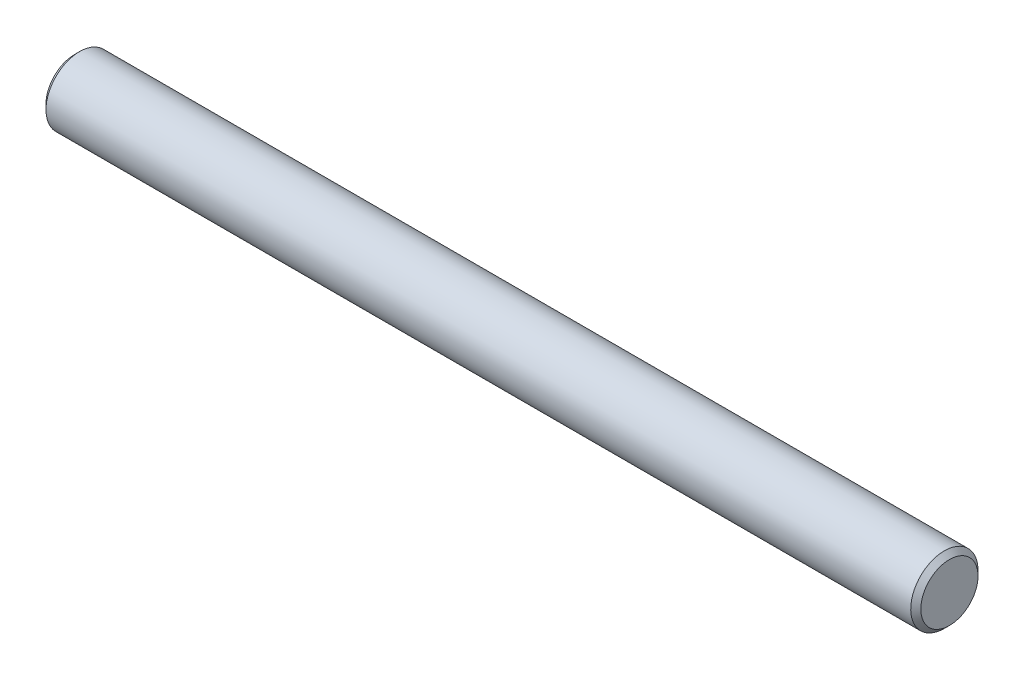
ISO-10303-21;
HEADER;
FILE_DESCRIPTION(('STEP AP214'),'2;1');
FILE_NAME('part.step','',(''),(''),'','','');
FILE_SCHEMA(('AUTOMOTIVE_DESIGN { 1 0 10303 214 1 1 1 1 }'));
ENDSEC;
DATA;
#1=APPLICATION_CONTEXT('core data for automotive mechanical design processes');
#2=APPLICATION_PROTOCOL_DEFINITION('international standard','automotive_design',2000,#1);
#3=PRODUCT_CONTEXT('',#1,'mechanical');
#4=PRODUCT('Part','Part','',(#3));
#5=PRODUCT_RELATED_PRODUCT_CATEGORY('part','',(#4));
#6=PRODUCT_DEFINITION_FORMATION('','',#4);
#7=PRODUCT_DEFINITION_CONTEXT('part definition',#1,'design');
#8=PRODUCT_DEFINITION('design','',#6,#7);
#9=PRODUCT_DEFINITION_SHAPE('','',#8);
#10=(LENGTH_UNIT() NAMED_UNIT(*) SI_UNIT(.MILLI.,.METRE.));
#11=(NAMED_UNIT(*) PLANE_ANGLE_UNIT() SI_UNIT($,.RADIAN.));
#12=(NAMED_UNIT(*) SI_UNIT($,.STERADIAN.) SOLID_ANGLE_UNIT());
#13=UNCERTAINTY_MEASURE_WITH_UNIT(LENGTH_MEASURE(1.E-05),#10,'distance_accuracy_value','');
#14=(GEOMETRIC_REPRESENTATION_CONTEXT(3) GLOBAL_UNCERTAINTY_ASSIGNED_CONTEXT((#13)) GLOBAL_UNIT_ASSIGNED_CONTEXT((#10,
#11,#12)) REPRESENTATION_CONTEXT('',''));
#15=CARTESIAN_POINT('',(0.,0.,0.));
#16=DIRECTION('',(0.,0.,1.));
#17=DIRECTION('',(1.,0.,0.));
#18=AXIS2_PLACEMENT_3D('',#15,#16,#17);
#19=CARTESIAN_POINT('',(0.,1.7,0.));
#20=DIRECTION('',(1.,0.,0.));
#21=DIRECTION('',(0.,1.,0.));
#22=AXIS2_PLACEMENT_3D('',#19,#20,#21);
#23=PLANE('',#22);
#24=CARTESIAN_POINT('',(0.,0.,0.));
#25=DIRECTION('',(1.,0.,0.));
#26=DIRECTION('',(0.,1.,0.));
#27=AXIS2_PLACEMENT_3D('',#24,#25,#26);
#28=CIRCLE('',#27,1.7);
#29=CARTESIAN_POINT('',(0.,1.7,0.));
#30=VERTEX_POINT('',#29);
#31=EDGE_CURVE('E44',#30,#30,#28,.T.);
#32=ORIENTED_EDGE('',*,*,#31,.T.);
#33=EDGE_LOOP('',(#32));
#34=FACE_BOUND('',#33,.T.);
#35=ADVANCED_FACE('F30',(#34),#23,.T.);
#36=CARTESIAN_POINT('',(-52.,0.,0.));
#37=DIRECTION('',(-1.,0.,0.));
#38=DIRECTION('',(0.,-1.,0.));
#39=AXIS2_PLACEMENT_3D('',#36,#37,#38);
#40=PLANE('',#39);
#41=CARTESIAN_POINT('',(-52.,0.,0.));
#42=DIRECTION('',(1.,0.,0.));
#43=DIRECTION('',(0.,1.,0.));
#44=AXIS2_PLACEMENT_3D('',#41,#42,#43);
#45=CIRCLE('',#44,1.7);
#46=CARTESIAN_POINT('',(-52.,1.69999999999999,0.));
#47=VERTEX_POINT('',#46);
#48=EDGE_CURVE('E10',#47,#47,#45,.T.);
#49=ORIENTED_EDGE('',*,*,#48,.F.);
#50=EDGE_LOOP('',(#49));
#51=FACE_BOUND('',#50,.T.);
#52=ADVANCED_FACE('F62',(#51),#40,.T.);
#53=CARTESIAN_POINT('',(-51.7,0.,0.));
#54=DIRECTION('',(1.,0.,0.));
#55=DIRECTION('',(0.,1.,0.));
#56=AXIS2_PLACEMENT_3D('',#53,#54,#55);
#57=CONICAL_SURFACE('',#56,2.,0.785398163397446);
#58=ORIENTED_EDGE('',*,*,#48,.T.);
#59=EDGE_LOOP('',(#58));
#60=FACE_BOUND('',#59,.T.);
#61=CARTESIAN_POINT('',(-51.7,0.,0.));
#62=DIRECTION('',(1.,0.,0.));
#63=DIRECTION('',(0.,1.,0.));
#64=AXIS2_PLACEMENT_3D('',#61,#62,#63);
#65=CIRCLE('',#64,2.);
#66=CARTESIAN_POINT('',(-51.7,1.99999999999999,0.));
#67=VERTEX_POINT('',#66);
#68=EDGE_CURVE('E36',#67,#67,#65,.T.);
#69=ORIENTED_EDGE('',*,*,#68,.F.);
#70=EDGE_LOOP('',(#69));
#71=FACE_BOUND('',#70,.T.);
#72=ADVANCED_FACE('F59',(#60,#71),#57,.T.);
#73=CARTESIAN_POINT('',(0.,0.,0.));
#74=DIRECTION('',(1.,0.,0.));
#75=DIRECTION('',(0.,1.,0.));
#76=AXIS2_PLACEMENT_3D('',#73,#74,#75);
#77=CYLINDRICAL_SURFACE('',#76,2.);
#78=ORIENTED_EDGE('',*,*,#68,.T.);
#79=EDGE_LOOP('',(#78));
#80=FACE_BOUND('',#79,.T.);
#81=CARTESIAN_POINT('',(-0.3,0.,0.));
#82=DIRECTION('',(1.,0.,0.));
#83=DIRECTION('',(0.,1.,0.));
#84=AXIS2_PLACEMENT_3D('',#81,#82,#83);
#85=CIRCLE('',#84,2.);
#86=CARTESIAN_POINT('',(-0.3,2.,0.));
#87=VERTEX_POINT('',#86);
#88=EDGE_CURVE('E40',#87,#87,#85,.T.);
#89=ORIENTED_EDGE('',*,*,#88,.F.);
#90=EDGE_LOOP('',(#89));
#91=FACE_BOUND('',#90,.T.);
#92=ADVANCED_FACE('F53',(#80,#91),#77,.T.);
#93=CARTESIAN_POINT('',(0.,0.,0.));
#94=DIRECTION('',(-1.,0.,0.));
#95=DIRECTION('',(0.,-1.,0.));
#96=AXIS2_PLACEMENT_3D('',#93,#94,#95);
#97=CONICAL_SURFACE('',#96,1.7,0.785398163397448);
#98=ORIENTED_EDGE('',*,*,#88,.T.);
#99=EDGE_LOOP('',(#98));
#100=FACE_BOUND('',#99,.T.);
#101=ORIENTED_EDGE('',*,*,#31,.F.);
#102=EDGE_LOOP('',(#101));
#103=FACE_BOUND('',#102,.T.);
#104=ADVANCED_FACE('F51',(#100,#103),#97,.T.);
#105=CLOSED_SHELL('',(#35,#52,#72,#92,#104));
#106=MANIFOLD_SOLID_BREP('B2',#105);
#107=ADVANCED_BREP_SHAPE_REPRESENTATION('',(#18,#106),#14);
#108=SHAPE_DEFINITION_REPRESENTATION(#9,#107);
ENDSEC;
END-ISO-10303-21;
